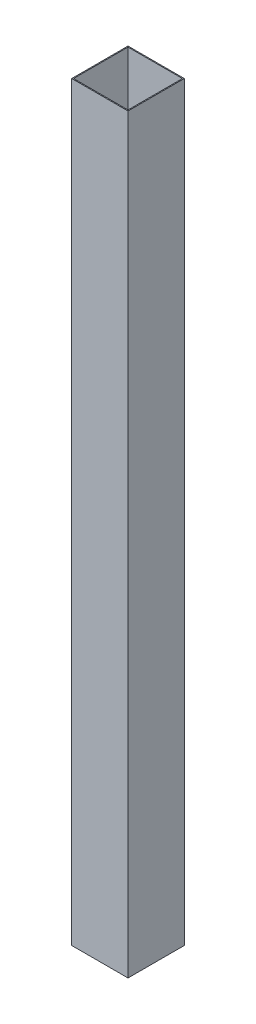
ISO-10303-21;
HEADER;
FILE_DESCRIPTION(('STEP AP214'),'2;1');
FILE_NAME('part.step','',(''),(''),'','','');
FILE_SCHEMA(('AUTOMOTIVE_DESIGN { 1 0 10303 214 1 1 1 1 }'));
ENDSEC;
DATA;
#1=APPLICATION_CONTEXT('core data for automotive mechanical design processes');
#2=APPLICATION_PROTOCOL_DEFINITION('international standard','automotive_design',2000,#1);
#3=PRODUCT_CONTEXT('',#1,'mechanical');
#4=PRODUCT('Part','Part','',(#3));
#5=PRODUCT_RELATED_PRODUCT_CATEGORY('part','',(#4));
#6=PRODUCT_DEFINITION_FORMATION('','',#4);
#7=PRODUCT_DEFINITION_CONTEXT('part definition',#1,'design');
#8=PRODUCT_DEFINITION('design','',#6,#7);
#9=PRODUCT_DEFINITION_SHAPE('','',#8);
#10=(LENGTH_UNIT() NAMED_UNIT(*) SI_UNIT(.MILLI.,.METRE.));
#11=(NAMED_UNIT(*) PLANE_ANGLE_UNIT() SI_UNIT($,.RADIAN.));
#12=(NAMED_UNIT(*) SI_UNIT($,.STERADIAN.) SOLID_ANGLE_UNIT());
#13=UNCERTAINTY_MEASURE_WITH_UNIT(LENGTH_MEASURE(1.E-05),#10,'distance_accuracy_value','');
#14=(GEOMETRIC_REPRESENTATION_CONTEXT(3) GLOBAL_UNCERTAINTY_ASSIGNED_CONTEXT((#13)) GLOBAL_UNIT_ASSIGNED_CONTEXT((#10,
#11,#12)) REPRESENTATION_CONTEXT('',''));
#15=CARTESIAN_POINT('',(0.,0.,0.));
#16=DIRECTION('',(0.,0.,1.));
#17=DIRECTION('',(1.,0.,0.));
#18=AXIS2_PLACEMENT_3D('',#15,#16,#17);
#19=CARTESIAN_POINT('',(0.,0.,0.));
#20=DIRECTION('',(0.,1.,0.));
#21=DIRECTION('',(0.,0.,1.));
#22=AXIS2_PLACEMENT_3D('',#19,#20,#21);
#23=PLANE('',#22);
#24=DIRECTION('',(0.,0.,-1.));
#25=VECTOR('',#24,1.);
#26=CARTESIAN_POINT('',(76.2,0.,-76.2));
#27=LINE('',#26,#25);
#28=CARTESIAN_POINT('',(76.2,0.,76.2));
#29=VERTEX_POINT('',#28);
#30=CARTESIAN_POINT('',(76.2,0.,-76.2));
#31=VERTEX_POINT('',#30);
#32=EDGE_CURVE('E145',#29,#31,#27,.T.);
#33=ORIENTED_EDGE('',*,*,#32,.F.);
#34=DIRECTION('',(1.,0.,0.));
#35=VECTOR('',#34,1.);
#36=CARTESIAN_POINT('',(-76.2,0.,76.2));
#37=LINE('',#36,#35);
#38=CARTESIAN_POINT('',(-76.2,0.,76.2));
#39=VERTEX_POINT('',#38);
#40=EDGE_CURVE('E136',#39,#29,#37,.T.);
#41=ORIENTED_EDGE('',*,*,#40,.F.);
#42=DIRECTION('',(0.,0.,1.));
#43=VECTOR('',#42,1.);
#44=CARTESIAN_POINT('',(-76.2,0.,-76.2));
#45=LINE('',#44,#43);
#46=CARTESIAN_POINT('',(-76.2,0.,-76.2));
#47=VERTEX_POINT('',#46);
#48=EDGE_CURVE('E140',#47,#39,#45,.T.);
#49=ORIENTED_EDGE('',*,*,#48,.F.);
#50=DIRECTION('',(-1.,0.,0.));
#51=VECTOR('',#50,1.);
#52=CARTESIAN_POINT('',(-76.2,0.,-76.2));
#53=LINE('',#52,#51);
#54=EDGE_CURVE('E125',#31,#47,#53,.T.);
#55=ORIENTED_EDGE('',*,*,#54,.F.);
#56=EDGE_LOOP('',(#33,#41,#49,#55));
#57=FACE_BOUND('',#56,.T.);
#58=DIRECTION('',(0.,0.,1.));
#59=VECTOR('',#58,1.);
#60=CARTESIAN_POINT('',(-73.66,0.,-73.66));
#61=LINE('',#60,#59);
#62=CARTESIAN_POINT('',(-73.66,0.,-73.66));
#63=VERTEX_POINT('',#62);
#64=CARTESIAN_POINT('',(-73.66,0.,73.66));
#65=VERTEX_POINT('',#64);
#66=EDGE_CURVE('E173',#63,#65,#61,.T.);
#67=ORIENTED_EDGE('',*,*,#66,.T.);
#68=DIRECTION('',(1.,0.,0.));
#69=VECTOR('',#68,1.);
#70=CARTESIAN_POINT('',(-73.66,0.,73.66));
#71=LINE('',#70,#69);
#72=CARTESIAN_POINT('',(73.66,0.,73.66));
#73=VERTEX_POINT('',#72);
#74=EDGE_CURVE('E169',#65,#73,#71,.T.);
#75=ORIENTED_EDGE('',*,*,#74,.T.);
#76=DIRECTION('',(0.,0.,-1.));
#77=VECTOR('',#76,1.);
#78=CARTESIAN_POINT('',(73.66,0.,-73.66));
#79=LINE('',#78,#77);
#80=CARTESIAN_POINT('',(73.66,0.,-73.66));
#81=VERTEX_POINT('',#80);
#82=EDGE_CURVE('E165',#73,#81,#79,.T.);
#83=ORIENTED_EDGE('',*,*,#82,.T.);
#84=DIRECTION('',(-1.,0.,0.));
#85=VECTOR('',#84,1.);
#86=CARTESIAN_POINT('',(-73.66,0.,-73.66));
#87=LINE('',#86,#85);
#88=EDGE_CURVE('E161',#81,#63,#87,.T.);
#89=ORIENTED_EDGE('',*,*,#88,.T.);
#90=EDGE_LOOP('',(#67,#75,#83,#89));
#91=FACE_BOUND('',#90,.T.);
#92=ADVANCED_FACE('F41',(#57,#91),#23,.F.);
#93=CARTESIAN_POINT('',(76.2,6604.,-76.2));
#94=DIRECTION('',(-1.,0.,0.));
#95=DIRECTION('',(0.,0.,1.));
#96=AXIS2_PLACEMENT_3D('',#93,#94,#95);
#97=PLANE('',#96);
#98=DIRECTION('',(0.,-1.,0.));
#99=VECTOR('',#98,1.);
#100=CARTESIAN_POINT('',(76.2,6604.,-76.2));
#101=LINE('',#100,#99);
#102=CARTESIAN_POINT('',(76.2,2032.,-76.2));
#103=VERTEX_POINT('',#102);
#104=EDGE_CURVE('E50',#103,#31,#101,.T.);
#105=ORIENTED_EDGE('',*,*,#104,.F.);
#106=DIRECTION('',(0.,0.,1.));
#107=VECTOR('',#106,1.);
#108=CARTESIAN_POINT('',(76.2,2032.,-76.2));
#109=LINE('',#108,#107);
#110=CARTESIAN_POINT('',(76.2,2032.,76.2));
#111=VERTEX_POINT('',#110);
#112=EDGE_CURVE('E107',#103,#111,#109,.T.);
#113=ORIENTED_EDGE('',*,*,#112,.T.);
#114=DIRECTION('',(0.,-1.,0.));
#115=VECTOR('',#114,1.);
#116=CARTESIAN_POINT('',(76.2,6604.,76.2));
#117=LINE('',#116,#115);
#118=EDGE_CURVE('E131',#111,#29,#117,.T.);
#119=ORIENTED_EDGE('',*,*,#118,.T.);
#120=ORIENTED_EDGE('',*,*,#32,.T.);
#121=EDGE_LOOP('',(#105,#113,#119,#120));
#122=FACE_BOUND('',#121,.T.);
#123=ADVANCED_FACE('F43',(#122),#97,.F.);
#124=CARTESIAN_POINT('',(-76.2,6604.,-76.2));
#125=DIRECTION('',(0.,0.,1.));
#126=DIRECTION('',(1.,0.,0.));
#127=AXIS2_PLACEMENT_3D('',#124,#125,#126);
#128=PLANE('',#127);
#129=DIRECTION('',(0.,-1.,0.));
#130=VECTOR('',#129,1.);
#131=CARTESIAN_POINT('',(-76.2,6604.,-76.2));
#132=LINE('',#131,#130);
#133=CARTESIAN_POINT('',(-76.1999999999995,2032.,-76.2));
#134=VERTEX_POINT('',#133);
#135=EDGE_CURVE('E118',#134,#47,#132,.T.);
#136=ORIENTED_EDGE('',*,*,#135,.F.);
#137=DIRECTION('',(1.,0.,0.));
#138=VECTOR('',#137,1.);
#139=CARTESIAN_POINT('',(-76.1999999999995,2032.,-76.2));
#140=LINE('',#139,#138);
#141=EDGE_CURVE('E104',#134,#103,#140,.T.);
#142=ORIENTED_EDGE('',*,*,#141,.T.);
#143=ORIENTED_EDGE('',*,*,#104,.T.);
#144=ORIENTED_EDGE('',*,*,#54,.T.);
#145=EDGE_LOOP('',(#136,#142,#143,#144));
#146=FACE_BOUND('',#145,.T.);
#147=ADVANCED_FACE('F123',(#146),#128,.F.);
#148=CARTESIAN_POINT('',(-76.2,6604.,-76.2));
#149=DIRECTION('',(1.,0.,0.));
#150=DIRECTION('',(0.,0.,-1.));
#151=AXIS2_PLACEMENT_3D('',#148,#149,#150);
#152=PLANE('',#151);
#153=DIRECTION('',(0.,-1.,0.));
#154=VECTOR('',#153,1.);
#155=CARTESIAN_POINT('',(-76.2,6604.,76.2));
#156=LINE('',#155,#154);
#157=CARTESIAN_POINT('',(-76.2,2032.,76.2));
#158=VERTEX_POINT('',#157);
#159=EDGE_CURVE('E120',#158,#39,#156,.T.);
#160=ORIENTED_EDGE('',*,*,#159,.F.);
#161=DIRECTION('',(0.,0.,1.));
#162=VECTOR('',#161,1.);
#163=CARTESIAN_POINT('',(-76.1999999999995,2032.,-76.2));
#164=LINE('',#163,#162);
#165=EDGE_CURVE('E57',#134,#158,#164,.T.);
#166=ORIENTED_EDGE('',*,*,#165,.F.);
#167=ORIENTED_EDGE('',*,*,#135,.T.);
#168=ORIENTED_EDGE('',*,*,#48,.T.);
#169=EDGE_LOOP('',(#160,#166,#167,#168));
#170=FACE_BOUND('',#169,.T.);
#171=ADVANCED_FACE('F116',(#170),#152,.F.);
#172=CARTESIAN_POINT('',(-76.2,6604.,76.2));
#173=DIRECTION('',(0.,0.,-1.));
#174=DIRECTION('',(-1.,0.,0.));
#175=AXIS2_PLACEMENT_3D('',#172,#173,#174);
#176=PLANE('',#175);
#177=ORIENTED_EDGE('',*,*,#118,.F.);
#178=DIRECTION('',(1.,0.,0.));
#179=VECTOR('',#178,1.);
#180=CARTESIAN_POINT('',(-76.1999999999995,2032.,76.2));
#181=LINE('',#180,#179);
#182=EDGE_CURVE('E112',#158,#111,#181,.T.);
#183=ORIENTED_EDGE('',*,*,#182,.F.);
#184=ORIENTED_EDGE('',*,*,#159,.T.);
#185=ORIENTED_EDGE('',*,*,#40,.T.);
#186=EDGE_LOOP('',(#177,#183,#184,#185));
#187=FACE_BOUND('',#186,.T.);
#188=ADVANCED_FACE('F191',(#187),#176,.F.);
#189=CARTESIAN_POINT('',(-73.66,6604.,-73.66));
#190=DIRECTION('',(1.,0.,0.));
#191=DIRECTION('',(0.,0.,-1.));
#192=AXIS2_PLACEMENT_3D('',#189,#190,#191);
#193=PLANE('',#192);
#194=DIRECTION('',(0.,0.,-1.));
#195=VECTOR('',#194,1.);
#196=CARTESIAN_POINT('',(-73.66,2032.,-73.66));
#197=LINE('',#196,#195);
#198=CARTESIAN_POINT('',(-73.66,2032.,73.66));
#199=VERTEX_POINT('',#198);
#200=CARTESIAN_POINT('',(-73.66,2032.,-73.66));
#201=VERTEX_POINT('',#200);
#202=EDGE_CURVE('E64',#199,#201,#197,.T.);
#203=ORIENTED_EDGE('',*,*,#202,.F.);
#204=DIRECTION('',(0.,-1.,0.));
#205=VECTOR('',#204,1.);
#206=CARTESIAN_POINT('',(-73.66,6604.,73.66));
#207=LINE('',#206,#205);
#208=EDGE_CURVE('E149',#199,#65,#207,.T.);
#209=ORIENTED_EDGE('',*,*,#208,.T.);
#210=ORIENTED_EDGE('',*,*,#66,.F.);
#211=DIRECTION('',(0.,-1.,0.));
#212=VECTOR('',#211,1.);
#213=CARTESIAN_POINT('',(-73.66,6604.,-73.66));
#214=LINE('',#213,#212);
#215=EDGE_CURVE('E158',#201,#63,#214,.T.);
#216=ORIENTED_EDGE('',*,*,#215,.F.);
#217=EDGE_LOOP('',(#203,#209,#210,#216));
#218=FACE_BOUND('',#217,.T.);
#219=ADVANCED_FACE('F203',(#218),#193,.T.);
#220=CARTESIAN_POINT('',(-73.66,6604.,73.66));
#221=DIRECTION('',(0.,0.,-1.));
#222=DIRECTION('',(-1.,0.,0.));
#223=AXIS2_PLACEMENT_3D('',#220,#221,#222);
#224=PLANE('',#223);
#225=DIRECTION('',(-1.,0.,0.));
#226=VECTOR('',#225,1.);
#227=CARTESIAN_POINT('',(-73.66,2032.,73.66));
#228=LINE('',#227,#226);
#229=CARTESIAN_POINT('',(73.66,2032.,73.66));
#230=VERTEX_POINT('',#229);
#231=EDGE_CURVE('E179',#230,#199,#228,.T.);
#232=ORIENTED_EDGE('',*,*,#231,.F.);
#233=DIRECTION('',(0.,-1.,0.));
#234=VECTOR('',#233,1.);
#235=CARTESIAN_POINT('',(73.66,6604.,73.66));
#236=LINE('',#235,#234);
#237=EDGE_CURVE('E152',#230,#73,#236,.T.);
#238=ORIENTED_EDGE('',*,*,#237,.T.);
#239=ORIENTED_EDGE('',*,*,#74,.F.);
#240=ORIENTED_EDGE('',*,*,#208,.F.);
#241=EDGE_LOOP('',(#232,#238,#239,#240));
#242=FACE_BOUND('',#241,.T.);
#243=ADVANCED_FACE('F207',(#242),#224,.T.);
#244=CARTESIAN_POINT('',(73.66,6604.,-73.66));
#245=DIRECTION('',(-1.,0.,0.));
#246=DIRECTION('',(0.,0.,1.));
#247=AXIS2_PLACEMENT_3D('',#244,#245,#246);
#248=PLANE('',#247);
#249=DIRECTION('',(0.,0.,1.));
#250=VECTOR('',#249,1.);
#251=CARTESIAN_POINT('',(73.66,2032.,-73.66));
#252=LINE('',#251,#250);
#253=CARTESIAN_POINT('',(73.66,2032.,-73.66));
#254=VERTEX_POINT('',#253);
#255=EDGE_CURVE('E182',#254,#230,#252,.T.);
#256=ORIENTED_EDGE('',*,*,#255,.F.);
#257=DIRECTION('',(0.,-1.,0.));
#258=VECTOR('',#257,1.);
#259=CARTESIAN_POINT('',(73.66,6604.,-73.66));
#260=LINE('',#259,#258);
#261=EDGE_CURVE('E155',#254,#81,#260,.T.);
#262=ORIENTED_EDGE('',*,*,#261,.T.);
#263=ORIENTED_EDGE('',*,*,#82,.F.);
#264=ORIENTED_EDGE('',*,*,#237,.F.);
#265=EDGE_LOOP('',(#256,#262,#263,#264));
#266=FACE_BOUND('',#265,.T.);
#267=ADVANCED_FACE('F212',(#266),#248,.T.);
#268=CARTESIAN_POINT('',(-73.66,6604.,-73.66));
#269=DIRECTION('',(0.,0.,1.));
#270=DIRECTION('',(1.,0.,0.));
#271=AXIS2_PLACEMENT_3D('',#268,#269,#270);
#272=PLANE('',#271);
#273=DIRECTION('',(1.,0.,0.));
#274=VECTOR('',#273,1.);
#275=CARTESIAN_POINT('',(-73.66,2032.,-73.66));
#276=LINE('',#275,#274);
#277=EDGE_CURVE('E11',#201,#254,#276,.T.);
#278=ORIENTED_EDGE('',*,*,#277,.F.);
#279=ORIENTED_EDGE('',*,*,#215,.T.);
#280=ORIENTED_EDGE('',*,*,#88,.F.);
#281=ORIENTED_EDGE('',*,*,#261,.F.);
#282=EDGE_LOOP('',(#278,#279,#280,#281));
#283=FACE_BOUND('',#282,.T.);
#284=ADVANCED_FACE('F215',(#283),#272,.T.);
#285=CARTESIAN_POINT('',(-76.1999999999995,2032.,-76.2));
#286=DIRECTION('',(0.,-1.,0.));
#287=DIRECTION('',(0.,0.,-1.));
#288=AXIS2_PLACEMENT_3D('',#285,#286,#287);
#289=PLANE('',#288);
#290=ORIENTED_EDGE('',*,*,#202,.T.);
#291=ORIENTED_EDGE('',*,*,#277,.T.);
#292=ORIENTED_EDGE('',*,*,#255,.T.);
#293=ORIENTED_EDGE('',*,*,#231,.T.);
#294=EDGE_LOOP('',(#290,#291,#292,#293));
#295=FACE_BOUND('',#294,.T.);
#296=ORIENTED_EDGE('',*,*,#182,.T.);
#297=ORIENTED_EDGE('',*,*,#112,.F.);
#298=ORIENTED_EDGE('',*,*,#141,.F.);
#299=ORIENTED_EDGE('',*,*,#165,.T.);
#300=EDGE_LOOP('',(#296,#297,#298,#299));
#301=FACE_BOUND('',#300,.T.);
#302=ADVANCED_FACE('F105',(#295,#301),#289,.F.);
#303=CLOSED_SHELL('',(#92,#123,#147,#171,#188,#219,#243,#267,#284,#302));
#304=MANIFOLD_SOLID_BREP('B2',#303);
#305=ADVANCED_BREP_SHAPE_REPRESENTATION('',(#18,#304),#14);
#306=SHAPE_DEFINITION_REPRESENTATION(#9,#305);
ENDSEC;
END-ISO-10303-21;
